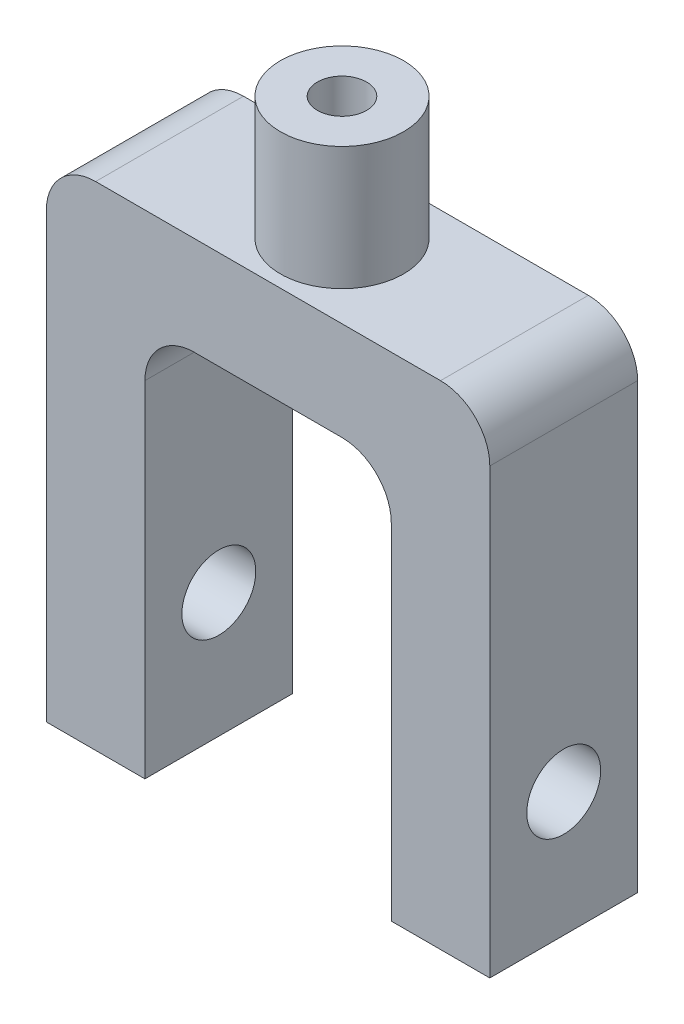
ISO-10303-21;
HEADER;
FILE_DESCRIPTION(('STEP AP214'),'2;1');
FILE_NAME('part.step','',(''),(''),'','','');
FILE_SCHEMA(('AUTOMOTIVE_DESIGN { 1 0 10303 214 1 1 1 1 }'));
ENDSEC;
DATA;
#1=APPLICATION_CONTEXT('core data for automotive mechanical design processes');
#2=APPLICATION_PROTOCOL_DEFINITION('international standard','automotive_design',2000,#1);
#3=PRODUCT_CONTEXT('',#1,'mechanical');
#4=PRODUCT('Part','Part','',(#3));
#5=PRODUCT_RELATED_PRODUCT_CATEGORY('part','',(#4));
#6=PRODUCT_DEFINITION_FORMATION('','',#4);
#7=PRODUCT_DEFINITION_CONTEXT('part definition',#1,'design');
#8=PRODUCT_DEFINITION('design','',#6,#7);
#9=PRODUCT_DEFINITION_SHAPE('','',#8);
#10=(LENGTH_UNIT() NAMED_UNIT(*) SI_UNIT(.MILLI.,.METRE.));
#11=(NAMED_UNIT(*) PLANE_ANGLE_UNIT() SI_UNIT($,.RADIAN.));
#12=(NAMED_UNIT(*) SI_UNIT($,.STERADIAN.) SOLID_ANGLE_UNIT());
#13=UNCERTAINTY_MEASURE_WITH_UNIT(LENGTH_MEASURE(1.E-05),#10,'distance_accuracy_value','');
#14=(GEOMETRIC_REPRESENTATION_CONTEXT(3) GLOBAL_UNCERTAINTY_ASSIGNED_CONTEXT((#13)) GLOBAL_UNIT_ASSIGNED_CONTEXT((#10,
#11,#12)) REPRESENTATION_CONTEXT('',''));
#15=CARTESIAN_POINT('',(0.,0.,0.));
#16=DIRECTION('',(0.,0.,1.));
#17=DIRECTION('',(1.,0.,0.));
#18=AXIS2_PLACEMENT_3D('',#15,#16,#17);
#19=CARTESIAN_POINT('',(0.,0.,30.));
#20=DIRECTION('',(0.,1.,0.));
#21=DIRECTION('',(0.,0.,1.));
#22=AXIS2_PLACEMENT_3D('',#19,#20,#21);
#23=PLANE('',#22);
#24=DIRECTION('',(1.,0.,0.));
#25=VECTOR('',#24,1.);
#26=CARTESIAN_POINT('',(0.,0.,0.));
#27=LINE('',#26,#25);
#28=CARTESIAN_POINT('',(0.,0.,0.));
#29=VERTEX_POINT('',#28);
#30=CARTESIAN_POINT('',(20.,0.,0.));
#31=VERTEX_POINT('',#30);
#32=EDGE_CURVE('E159',#29,#31,#27,.T.);
#33=ORIENTED_EDGE('',*,*,#32,.T.);
#34=DIRECTION('',(0.,0.,-1.));
#35=VECTOR('',#34,1.);
#36=CARTESIAN_POINT('',(20.,0.,30.));
#37=LINE('',#36,#35);
#38=CARTESIAN_POINT('',(20.,0.,30.));
#39=VERTEX_POINT('',#38);
#40=EDGE_CURVE('E140',#39,#31,#37,.T.);
#41=ORIENTED_EDGE('',*,*,#40,.F.);
#42=DIRECTION('',(1.,0.,0.));
#43=VECTOR('',#42,1.);
#44=CARTESIAN_POINT('',(0.,0.,30.));
#45=LINE('',#44,#43);
#46=CARTESIAN_POINT('',(0.,0.,30.));
#47=VERTEX_POINT('',#46);
#48=EDGE_CURVE('E147',#47,#39,#45,.T.);
#49=ORIENTED_EDGE('',*,*,#48,.F.);
#50=DIRECTION('',(0.,0.,-1.));
#51=VECTOR('',#50,1.);
#52=CARTESIAN_POINT('',(0.,0.,30.));
#53=LINE('',#52,#51);
#54=EDGE_CURVE('E230',#47,#29,#53,.T.);
#55=ORIENTED_EDGE('',*,*,#54,.T.);
#56=EDGE_LOOP('',(#33,#41,#49,#55));
#57=FACE_BOUND('',#56,.T.);
#58=ADVANCED_FACE('F42',(#57),#23,.F.);
#59=CARTESIAN_POINT('',(20.,0.,30.));
#60=DIRECTION('',(-1.,0.,0.));
#61=DIRECTION('',(0.,0.,1.));
#62=AXIS2_PLACEMENT_3D('',#59,#60,#61);
#63=PLANE('',#62);
#64=CARTESIAN_POINT('',(20.,25.2498921631741,15.));
#65=DIRECTION('',(-1.,0.,0.));
#66=DIRECTION('',(0.,0.,1.));
#67=AXIS2_PLACEMENT_3D('',#64,#65,#66);
#68=CIRCLE('',#67,7.5);
#69=CARTESIAN_POINT('',(20.,25.2498921631741,22.5));
#70=VERTEX_POINT('',#69);
#71=EDGE_CURVE('E218',#70,#70,#68,.T.);
#72=ORIENTED_EDGE('',*,*,#71,.T.);
#73=EDGE_LOOP('',(#72));
#74=FACE_BOUND('',#73,.T.);
#75=DIRECTION('',(0.,1.,0.));
#76=VECTOR('',#75,1.);
#77=CARTESIAN_POINT('',(20.,0.,0.));
#78=LINE('',#77,#76);
#79=CARTESIAN_POINT('',(20.,70.,0.));
#80=VERTEX_POINT('',#79);
#81=EDGE_CURVE('E213',#31,#80,#78,.T.);
#82=ORIENTED_EDGE('',*,*,#81,.T.);
#83=DIRECTION('',(0.,0.,-1.));
#84=VECTOR('',#83,1.);
#85=CARTESIAN_POINT('',(20.,70.,30.));
#86=LINE('',#85,#84);
#87=CARTESIAN_POINT('',(20.,70.,30.));
#88=VERTEX_POINT('',#87);
#89=EDGE_CURVE('E143',#80,#88,#86,.F.);
#90=ORIENTED_EDGE('',*,*,#89,.T.);
#91=DIRECTION('',(0.,1.,0.));
#92=VECTOR('',#91,1.);
#93=CARTESIAN_POINT('',(20.,0.,30.));
#94=LINE('',#93,#92);
#95=EDGE_CURVE('E135',#39,#88,#94,.T.);
#96=ORIENTED_EDGE('',*,*,#95,.F.);
#97=ORIENTED_EDGE('',*,*,#40,.T.);
#98=EDGE_LOOP('',(#82,#90,#96,#97));
#99=FACE_BOUND('',#98,.T.);
#100=ADVANCED_FACE('F138',(#74,#99),#63,.F.);
#101=CARTESIAN_POINT('',(20.,80.,30.));
#102=DIRECTION('',(0.,1.,0.));
#103=DIRECTION('',(0.,0.,1.));
#104=AXIS2_PLACEMENT_3D('',#101,#102,#103);
#105=PLANE('',#104);
#106=DIRECTION('',(1.,0.,0.));
#107=VECTOR('',#106,1.);
#108=CARTESIAN_POINT('',(20.,80.,0.));
#109=LINE('',#108,#107);
#110=CARTESIAN_POINT('',(30.,80.,0.));
#111=VERTEX_POINT('',#110);
#112=CARTESIAN_POINT('',(60.,80.,0.));
#113=VERTEX_POINT('',#112);
#114=EDGE_CURVE('E214',#111,#113,#109,.T.);
#115=ORIENTED_EDGE('',*,*,#114,.T.);
#116=DIRECTION('',(0.,0.,-1.));
#117=VECTOR('',#116,1.);
#118=CARTESIAN_POINT('',(60.,80.,30.));
#119=LINE('',#118,#117);
#120=CARTESIAN_POINT('',(60.,80.,30.));
#121=VERTEX_POINT('',#120);
#122=EDGE_CURVE('E173',#113,#121,#119,.F.);
#123=ORIENTED_EDGE('',*,*,#122,.T.);
#124=DIRECTION('',(1.,0.,0.));
#125=VECTOR('',#124,1.);
#126=CARTESIAN_POINT('',(20.,80.,30.));
#127=LINE('',#126,#125);
#128=CARTESIAN_POINT('',(30.,80.,30.));
#129=VERTEX_POINT('',#128);
#130=EDGE_CURVE('E146',#129,#121,#127,.T.);
#131=ORIENTED_EDGE('',*,*,#130,.F.);
#132=DIRECTION('',(0.,0.,-1.));
#133=VECTOR('',#132,1.);
#134=CARTESIAN_POINT('',(30.,80.,0.));
#135=LINE('',#134,#133);
#136=EDGE_CURVE('E164',#129,#111,#135,.T.);
#137=ORIENTED_EDGE('',*,*,#136,.T.);
#138=EDGE_LOOP('',(#115,#123,#131,#137));
#139=FACE_BOUND('',#138,.T.);
#140=ADVANCED_FACE('F204',(#139),#105,.F.);
#141=CARTESIAN_POINT('',(70.,80.,30.));
#142=DIRECTION('',(1.,0.,0.));
#143=DIRECTION('',(0.,1.,0.));
#144=AXIS2_PLACEMENT_3D('',#141,#142,#143);
#145=PLANE('',#144);
#146=CARTESIAN_POINT('',(70.,25.2498921631741,15.));
#147=DIRECTION('',(1.,0.,0.));
#148=DIRECTION('',(0.,1.,0.));
#149=AXIS2_PLACEMENT_3D('',#146,#147,#148);
#150=CIRCLE('',#149,7.5);
#151=CARTESIAN_POINT('',(70.,32.7498921631741,15.));
#152=VERTEX_POINT('',#151);
#153=EDGE_CURVE('E255',#152,#152,#150,.T.);
#154=ORIENTED_EDGE('',*,*,#153,.T.);
#155=EDGE_LOOP('',(#154));
#156=FACE_BOUND('',#155,.T.);
#157=DIRECTION('',(0.,-1.,0.));
#158=VECTOR('',#157,1.);
#159=CARTESIAN_POINT('',(70.,80.,30.));
#160=LINE('',#159,#158);
#161=CARTESIAN_POINT('',(70.,70.,30.));
#162=VERTEX_POINT('',#161);
#163=CARTESIAN_POINT('',(70.,0.,30.));
#164=VERTEX_POINT('',#163);
#165=EDGE_CURVE('E207',#162,#164,#160,.T.);
#166=ORIENTED_EDGE('',*,*,#165,.F.);
#167=DIRECTION('',(0.,0.,-1.));
#168=VECTOR('',#167,1.);
#169=CARTESIAN_POINT('',(70.,70.,0.));
#170=LINE('',#169,#168);
#171=CARTESIAN_POINT('',(70.,70.,0.));
#172=VERTEX_POINT('',#171);
#173=EDGE_CURVE('E160',#162,#172,#170,.T.);
#174=ORIENTED_EDGE('',*,*,#173,.T.);
#175=DIRECTION('',(0.,-1.,0.));
#176=VECTOR('',#175,1.);
#177=CARTESIAN_POINT('',(70.,80.,0.));
#178=LINE('',#177,#176);
#179=CARTESIAN_POINT('',(70.,0.,0.));
#180=VERTEX_POINT('',#179);
#181=EDGE_CURVE('E216',#172,#180,#178,.T.);
#182=ORIENTED_EDGE('',*,*,#181,.T.);
#183=DIRECTION('',(0.,0.,-1.));
#184=VECTOR('',#183,1.);
#185=CARTESIAN_POINT('',(70.,0.,30.));
#186=LINE('',#185,#184);
#187=EDGE_CURVE('E161',#164,#180,#186,.T.);
#188=ORIENTED_EDGE('',*,*,#187,.F.);
#189=EDGE_LOOP('',(#166,#174,#182,#188));
#190=FACE_BOUND('',#189,.T.);
#191=ADVANCED_FACE('F335',(#156,#190),#145,.F.);
#192=CARTESIAN_POINT('',(70.,0.,30.));
#193=DIRECTION('',(0.,1.,0.));
#194=DIRECTION('',(0.,0.,1.));
#195=AXIS2_PLACEMENT_3D('',#192,#193,#194);
#196=PLANE('',#195);
#197=DIRECTION('',(1.,0.,0.));
#198=VECTOR('',#197,1.);
#199=CARTESIAN_POINT('',(70.,0.,0.));
#200=LINE('',#199,#198);
#201=CARTESIAN_POINT('',(90.,0.,0.));
#202=VERTEX_POINT('',#201);
#203=EDGE_CURVE('E223',#180,#202,#200,.T.);
#204=ORIENTED_EDGE('',*,*,#203,.T.);
#205=DIRECTION('',(0.,0.,-1.));
#206=VECTOR('',#205,1.);
#207=CARTESIAN_POINT('',(90.,0.,30.));
#208=LINE('',#207,#206);
#209=CARTESIAN_POINT('',(90.,0.,30.));
#210=VERTEX_POINT('',#209);
#211=EDGE_CURVE('E167',#210,#202,#208,.T.);
#212=ORIENTED_EDGE('',*,*,#211,.F.);
#213=DIRECTION('',(1.,0.,0.));
#214=VECTOR('',#213,1.);
#215=CARTESIAN_POINT('',(70.,0.,30.));
#216=LINE('',#215,#214);
#217=EDGE_CURVE('E248',#164,#210,#216,.T.);
#218=ORIENTED_EDGE('',*,*,#217,.F.);
#219=ORIENTED_EDGE('',*,*,#187,.T.);
#220=EDGE_LOOP('',(#204,#212,#218,#219));
#221=FACE_BOUND('',#220,.T.);
#222=ADVANCED_FACE('F331',(#221),#196,.F.);
#223=CARTESIAN_POINT('',(90.,100.,30.));
#224=DIRECTION('',(-1.,0.,0.));
#225=DIRECTION('',(0.,-1.,0.));
#226=AXIS2_PLACEMENT_3D('',#223,#224,#225);
#227=PLANE('',#226);
#228=CARTESIAN_POINT('',(90.,25.2498921631741,15.));
#229=DIRECTION('',(1.,0.,0.));
#230=DIRECTION('',(0.,1.,0.));
#231=AXIS2_PLACEMENT_3D('',#228,#229,#230);
#232=CIRCLE('',#231,7.5);
#233=CARTESIAN_POINT('',(90.,32.7498921631741,15.));
#234=VERTEX_POINT('',#233);
#235=EDGE_CURVE('E259',#234,#234,#232,.T.);
#236=ORIENTED_EDGE('',*,*,#235,.F.);
#237=EDGE_LOOP('',(#236));
#238=FACE_BOUND('',#237,.T.);
#239=DIRECTION('',(0.,1.,0.));
#240=VECTOR('',#239,1.);
#241=CARTESIAN_POINT('',(90.,100.,0.));
#242=LINE('',#241,#240);
#243=CARTESIAN_POINT('',(90.,90.,0.));
#244=VERTEX_POINT('',#243);
#245=EDGE_CURVE('E225',#202,#244,#242,.T.);
#246=ORIENTED_EDGE('',*,*,#245,.T.);
#247=DIRECTION('',(0.,0.,-1.));
#248=VECTOR('',#247,1.);
#249=CARTESIAN_POINT('',(90.,90.,30.));
#250=LINE('',#249,#248);
#251=CARTESIAN_POINT('',(90.,90.,30.));
#252=VERTEX_POINT('',#251);
#253=EDGE_CURVE('E57',#244,#252,#250,.F.);
#254=ORIENTED_EDGE('',*,*,#253,.T.);
#255=DIRECTION('',(0.,1.,0.));
#256=VECTOR('',#255,1.);
#257=CARTESIAN_POINT('',(90.,100.,30.));
#258=LINE('',#257,#256);
#259=EDGE_CURVE('E235',#210,#252,#258,.T.);
#260=ORIENTED_EDGE('',*,*,#259,.F.);
#261=ORIENTED_EDGE('',*,*,#211,.T.);
#262=EDGE_LOOP('',(#246,#254,#260,#261));
#263=FACE_BOUND('',#262,.T.);
#264=ADVANCED_FACE('F234',(#238,#263),#227,.F.);
#265=CARTESIAN_POINT('',(0.,100.,30.));
#266=DIRECTION('',(0.,-1.,0.));
#267=DIRECTION('',(0.,0.,-1.));
#268=AXIS2_PLACEMENT_3D('',#265,#266,#267);
#269=PLANE('',#268);
#270=CARTESIAN_POINT('',(45.,100.,15.));
#271=DIRECTION('',(0.,-1.,0.));
#272=DIRECTION('',(0.,0.,-1.));
#273=AXIS2_PLACEMENT_3D('',#270,#271,#272);
#274=CIRCLE('',#273,12.5);
#275=CARTESIAN_POINT('',(45.,100.,2.5));
#276=VERTEX_POINT('',#275);
#277=EDGE_CURVE('E11',#276,#276,#274,.F.);
#278=ORIENTED_EDGE('',*,*,#277,.F.);
#279=EDGE_LOOP('',(#278));
#280=FACE_BOUND('',#279,.T.);
#281=DIRECTION('',(-1.,0.,0.));
#282=VECTOR('',#281,1.);
#283=CARTESIAN_POINT('',(0.,100.,0.));
#284=LINE('',#283,#282);
#285=CARTESIAN_POINT('',(80.,100.,0.));
#286=VERTEX_POINT('',#285);
#287=CARTESIAN_POINT('',(10.,100.,0.));
#288=VERTEX_POINT('',#287);
#289=EDGE_CURVE('E227',#286,#288,#284,.T.);
#290=ORIENTED_EDGE('',*,*,#289,.T.);
#291=DIRECTION('',(0.,0.,-1.));
#292=VECTOR('',#291,1.);
#293=CARTESIAN_POINT('',(10.,100.,30.));
#294=LINE('',#293,#292);
#295=CARTESIAN_POINT('',(10.,100.,30.));
#296=VERTEX_POINT('',#295);
#297=EDGE_CURVE('E65',#288,#296,#294,.F.);
#298=ORIENTED_EDGE('',*,*,#297,.T.);
#299=DIRECTION('',(-1.,0.,0.));
#300=VECTOR('',#299,1.);
#301=CARTESIAN_POINT('',(0.,100.,30.));
#302=LINE('',#301,#300);
#303=CARTESIAN_POINT('',(80.,100.,30.));
#304=VERTEX_POINT('',#303);
#305=EDGE_CURVE('E245',#304,#296,#302,.T.);
#306=ORIENTED_EDGE('',*,*,#305,.F.);
#307=DIRECTION('',(0.,0.,-1.));
#308=VECTOR('',#307,1.);
#309=CARTESIAN_POINT('',(80.,100.,30.));
#310=LINE('',#309,#308);
#311=EDGE_CURVE('E183',#304,#286,#310,.T.);
#312=ORIENTED_EDGE('',*,*,#311,.T.);
#313=EDGE_LOOP('',(#290,#298,#306,#312));
#314=FACE_BOUND('',#313,.T.);
#315=ADVANCED_FACE('F244',(#280,#314),#269,.F.);
#316=CARTESIAN_POINT('',(0.,0.,30.));
#317=DIRECTION('',(1.,0.,0.));
#318=DIRECTION('',(0.,0.,-1.));
#319=AXIS2_PLACEMENT_3D('',#316,#317,#318);
#320=PLANE('',#319);
#321=CARTESIAN_POINT('',(0.,25.2498921631741,15.));
#322=DIRECTION('',(1.,0.,0.));
#323=DIRECTION('',(0.,1.,0.));
#324=AXIS2_PLACEMENT_3D('',#321,#322,#323);
#325=CIRCLE('',#324,7.5);
#326=CARTESIAN_POINT('',(0.,32.7498921631741,15.));
#327=VERTEX_POINT('',#326);
#328=EDGE_CURVE('E258',#327,#327,#325,.T.);
#329=ORIENTED_EDGE('',*,*,#328,.T.);
#330=EDGE_LOOP('',(#329));
#331=FACE_BOUND('',#330,.T.);
#332=DIRECTION('',(0.,-1.,0.));
#333=VECTOR('',#332,1.);
#334=CARTESIAN_POINT('',(0.,0.,30.));
#335=LINE('',#334,#333);
#336=CARTESIAN_POINT('',(0.,90.,30.));
#337=VERTEX_POINT('',#336);
#338=EDGE_CURVE('E152',#337,#47,#335,.T.);
#339=ORIENTED_EDGE('',*,*,#338,.F.);
#340=DIRECTION('',(0.,0.,-1.));
#341=VECTOR('',#340,1.);
#342=CARTESIAN_POINT('',(0.,90.,30.));
#343=LINE('',#342,#341);
#344=CARTESIAN_POINT('',(0.,90.,0.));
#345=VERTEX_POINT('',#344);
#346=EDGE_CURVE('E176',#337,#345,#343,.T.);
#347=ORIENTED_EDGE('',*,*,#346,.T.);
#348=DIRECTION('',(0.,-1.,0.));
#349=VECTOR('',#348,1.);
#350=CARTESIAN_POINT('',(0.,0.,0.));
#351=LINE('',#350,#349);
#352=EDGE_CURVE('E156',#345,#29,#351,.T.);
#353=ORIENTED_EDGE('',*,*,#352,.T.);
#354=ORIENTED_EDGE('',*,*,#54,.F.);
#355=EDGE_LOOP('',(#339,#347,#353,#354));
#356=FACE_BOUND('',#355,.T.);
#357=ADVANCED_FACE('F315',(#331,#356),#320,.F.);
#358=CARTESIAN_POINT('',(0.,0.,30.));
#359=DIRECTION('',(0.,0.,1.));
#360=DIRECTION('',(1.,0.,0.));
#361=AXIS2_PLACEMENT_3D('',#358,#359,#360);
#362=PLANE('',#361);
#363=ORIENTED_EDGE('',*,*,#305,.T.);
#364=CARTESIAN_POINT('',(10.,90.,30.));
#365=DIRECTION('',(0.,0.,1.));
#366=DIRECTION('',(1.,0.,0.));
#367=AXIS2_PLACEMENT_3D('',#364,#365,#366);
#368=CIRCLE('',#367,10.);
#369=EDGE_CURVE('E189',#296,#337,#368,.T.);
#370=ORIENTED_EDGE('',*,*,#369,.T.);
#371=ORIENTED_EDGE('',*,*,#338,.T.);
#372=ORIENTED_EDGE('',*,*,#48,.T.);
#373=ORIENTED_EDGE('',*,*,#95,.T.);
#374=CARTESIAN_POINT('',(30.,70.,30.));
#375=DIRECTION('',(0.,0.,1.));
#376=DIRECTION('',(1.,0.,0.));
#377=AXIS2_PLACEMENT_3D('',#374,#375,#376);
#378=CIRCLE('',#377,10.);
#379=EDGE_CURVE('E50',#88,#129,#378,.F.);
#380=ORIENTED_EDGE('',*,*,#379,.T.);
#381=ORIENTED_EDGE('',*,*,#130,.T.);
#382=CARTESIAN_POINT('',(60.,70.,30.));
#383=DIRECTION('',(0.,0.,1.));
#384=DIRECTION('',(1.,0.,0.));
#385=AXIS2_PLACEMENT_3D('',#382,#383,#384);
#386=CIRCLE('',#385,10.);
#387=EDGE_CURVE('E194',#121,#162,#386,.F.);
#388=ORIENTED_EDGE('',*,*,#387,.T.);
#389=ORIENTED_EDGE('',*,*,#165,.T.);
#390=ORIENTED_EDGE('',*,*,#217,.T.);
#391=ORIENTED_EDGE('',*,*,#259,.T.);
#392=CARTESIAN_POINT('',(80.,90.,30.));
#393=DIRECTION('',(0.,0.,1.));
#394=DIRECTION('',(1.,0.,0.));
#395=AXIS2_PLACEMENT_3D('',#392,#393,#394);
#396=CIRCLE('',#395,10.);
#397=EDGE_CURVE('E187',#252,#304,#396,.T.);
#398=ORIENTED_EDGE('',*,*,#397,.T.);
#399=EDGE_LOOP('',(#363,#370,#371,#372,#373,#380,#381,#388,#389,#390,#391,#398));
#400=FACE_BOUND('',#399,.T.);
#401=ADVANCED_FACE('F150',(#400),#362,.T.);
#402=CARTESIAN_POINT('',(0.,0.,0.));
#403=DIRECTION('',(0.,0.,1.));
#404=DIRECTION('',(1.,0.,0.));
#405=AXIS2_PLACEMENT_3D('',#402,#403,#404);
#406=PLANE('',#405);
#407=ORIENTED_EDGE('',*,*,#352,.F.);
#408=CARTESIAN_POINT('',(10.,90.,0.));
#409=DIRECTION('',(0.,0.,1.));
#410=DIRECTION('',(1.,0.,0.));
#411=AXIS2_PLACEMENT_3D('',#408,#409,#410);
#412=CIRCLE('',#411,10.);
#413=EDGE_CURVE('E181',#345,#288,#412,.F.);
#414=ORIENTED_EDGE('',*,*,#413,.T.);
#415=ORIENTED_EDGE('',*,*,#289,.F.);
#416=CARTESIAN_POINT('',(80.,90.,0.));
#417=DIRECTION('',(0.,0.,1.));
#418=DIRECTION('',(1.,0.,0.));
#419=AXIS2_PLACEMENT_3D('',#416,#417,#418);
#420=CIRCLE('',#419,10.);
#421=EDGE_CURVE('E179',#286,#244,#420,.F.);
#422=ORIENTED_EDGE('',*,*,#421,.T.);
#423=ORIENTED_EDGE('',*,*,#245,.F.);
#424=ORIENTED_EDGE('',*,*,#203,.F.);
#425=ORIENTED_EDGE('',*,*,#181,.F.);
#426=CARTESIAN_POINT('',(60.,70.,0.));
#427=DIRECTION('',(0.,0.,1.));
#428=DIRECTION('',(1.,0.,0.));
#429=AXIS2_PLACEMENT_3D('',#426,#427,#428);
#430=CIRCLE('',#429,10.);
#431=EDGE_CURVE('E192',#172,#113,#430,.T.);
#432=ORIENTED_EDGE('',*,*,#431,.T.);
#433=ORIENTED_EDGE('',*,*,#114,.F.);
#434=CARTESIAN_POINT('',(30.,70.,0.));
#435=DIRECTION('',(0.,0.,1.));
#436=DIRECTION('',(1.,0.,0.));
#437=AXIS2_PLACEMENT_3D('',#434,#435,#436);
#438=CIRCLE('',#437,10.);
#439=EDGE_CURVE('E196',#111,#80,#438,.T.);
#440=ORIENTED_EDGE('',*,*,#439,.T.);
#441=ORIENTED_EDGE('',*,*,#81,.F.);
#442=ORIENTED_EDGE('',*,*,#32,.F.);
#443=EDGE_LOOP('',(#407,#414,#415,#422,#423,#424,#425,#432,#433,#440,#441,#442));
#444=FACE_BOUND('',#443,.T.);
#445=ADVANCED_FACE('F212',(#444),#406,.F.);
#446=CARTESIAN_POINT('',(60.,70.,30.));
#447=DIRECTION('',(0.,0.,1.));
#448=DIRECTION('',(1.,0.,0.));
#449=AXIS2_PLACEMENT_3D('',#446,#447,#448);
#450=CYLINDRICAL_SURFACE('',#449,10.);
#451=ORIENTED_EDGE('',*,*,#387,.F.);
#452=ORIENTED_EDGE('',*,*,#122,.F.);
#453=ORIENTED_EDGE('',*,*,#431,.F.);
#454=ORIENTED_EDGE('',*,*,#173,.F.);
#455=EDGE_LOOP('',(#451,#452,#453,#454));
#456=FACE_BOUND('',#455,.T.);
#457=ADVANCED_FACE('F302',(#456),#450,.F.);
#458=CARTESIAN_POINT('',(30.,70.,30.));
#459=DIRECTION('',(0.,0.,1.));
#460=DIRECTION('',(1.,0.,0.));
#461=AXIS2_PLACEMENT_3D('',#458,#459,#460);
#462=CYLINDRICAL_SURFACE('',#461,10.);
#463=ORIENTED_EDGE('',*,*,#379,.F.);
#464=ORIENTED_EDGE('',*,*,#89,.F.);
#465=ORIENTED_EDGE('',*,*,#439,.F.);
#466=ORIENTED_EDGE('',*,*,#136,.F.);
#467=EDGE_LOOP('',(#463,#464,#465,#466));
#468=FACE_BOUND('',#467,.T.);
#469=ADVANCED_FACE('F209',(#468),#462,.F.);
#470=CARTESIAN_POINT('',(10.,90.,30.));
#471=DIRECTION('',(0.,0.,-1.));
#472=DIRECTION('',(-1.,0.,0.));
#473=AXIS2_PLACEMENT_3D('',#470,#471,#472);
#474=CYLINDRICAL_SURFACE('',#473,10.);
#475=ORIENTED_EDGE('',*,*,#369,.F.);
#476=ORIENTED_EDGE('',*,*,#297,.F.);
#477=ORIENTED_EDGE('',*,*,#413,.F.);
#478=ORIENTED_EDGE('',*,*,#346,.F.);
#479=EDGE_LOOP('',(#475,#476,#477,#478));
#480=FACE_BOUND('',#479,.T.);
#481=ADVANCED_FACE('F307',(#480),#474,.T.);
#482=CARTESIAN_POINT('',(80.,90.,30.));
#483=DIRECTION('',(0.,0.,-1.));
#484=DIRECTION('',(-1.,0.,0.));
#485=AXIS2_PLACEMENT_3D('',#482,#483,#484);
#486=CYLINDRICAL_SURFACE('',#485,10.);
#487=ORIENTED_EDGE('',*,*,#397,.F.);
#488=ORIENTED_EDGE('',*,*,#253,.F.);
#489=ORIENTED_EDGE('',*,*,#421,.F.);
#490=ORIENTED_EDGE('',*,*,#311,.F.);
#491=EDGE_LOOP('',(#487,#488,#489,#490));
#492=FACE_BOUND('',#491,.T.);
#493=ADVANCED_FACE('F44',(#492),#486,.T.);
#494=CARTESIAN_POINT('',(0.,25.2498921631741,15.));
#495=DIRECTION('',(1.,0.,0.));
#496=DIRECTION('',(0.,1.,0.));
#497=AXIS2_PLACEMENT_3D('',#494,#495,#496);
#498=CYLINDRICAL_SURFACE('',#497,7.5);
#499=ORIENTED_EDGE('',*,*,#328,.F.);
#500=EDGE_LOOP('',(#499));
#501=FACE_BOUND('',#500,.T.);
#502=ORIENTED_EDGE('',*,*,#71,.F.);
#503=EDGE_LOOP('',(#502));
#504=FACE_BOUND('',#503,.T.);
#505=ADVANCED_FACE('F289',(#501,#504),#498,.F.);
#506=ORIENTED_EDGE('',*,*,#235,.T.);
#507=EDGE_LOOP('',(#506));
#508=FACE_BOUND('',#507,.T.);
#509=ORIENTED_EDGE('',*,*,#153,.F.);
#510=EDGE_LOOP('',(#509));
#511=FACE_BOUND('',#510,.T.);
#512=ADVANCED_FACE('F280',(#508,#511),#498,.F.);
#513=CARTESIAN_POINT('',(45.,125.,15.));
#514=DIRECTION('',(0.,1.,0.));
#515=DIRECTION('',(0.,0.,1.));
#516=AXIS2_PLACEMENT_3D('',#513,#514,#515);
#517=PLANE('',#516);
#518=CARTESIAN_POINT('',(45.,125.,15.));
#519=DIRECTION('',(0.,1.,0.));
#520=DIRECTION('',(0.,0.,1.));
#521=AXIS2_PLACEMENT_3D('',#518,#519,#520);
#522=CIRCLE('',#521,12.5);
#523=CARTESIAN_POINT('',(45.,125.,27.5));
#524=VERTEX_POINT('',#523);
#525=EDGE_CURVE('E262',#524,#524,#522,.T.);
#526=ORIENTED_EDGE('',*,*,#525,.T.);
#527=EDGE_LOOP('',(#526));
#528=FACE_BOUND('',#527,.T.);
#529=CARTESIAN_POINT('',(45.,125.,15.));
#530=DIRECTION('',(0.,1.,0.));
#531=DIRECTION('',(0.,0.,1.));
#532=AXIS2_PLACEMENT_3D('',#529,#530,#531);
#533=CIRCLE('',#532,5.);
#534=CARTESIAN_POINT('',(45.,125.,20.));
#535=VERTEX_POINT('',#534);
#536=EDGE_CURVE('E267',#535,#535,#533,.T.);
#537=ORIENTED_EDGE('',*,*,#536,.F.);
#538=EDGE_LOOP('',(#537));
#539=FACE_BOUND('',#538,.T.);
#540=ADVANCED_FACE('F277',(#528,#539),#517,.T.);
#541=CARTESIAN_POINT('',(45.,125.,15.));
#542=DIRECTION('',(0.,-1.,0.));
#543=DIRECTION('',(0.,0.,-1.));
#544=AXIS2_PLACEMENT_3D('',#541,#542,#543);
#545=CYLINDRICAL_SURFACE('',#544,12.5);
#546=ORIENTED_EDGE('',*,*,#525,.F.);
#547=EDGE_LOOP('',(#546));
#548=FACE_BOUND('',#547,.T.);
#549=ORIENTED_EDGE('',*,*,#277,.T.);
#550=EDGE_LOOP('',(#549));
#551=FACE_BOUND('',#550,.T.);
#552=ADVANCED_FACE('F279',(#548,#551),#545,.T.);
#553=CARTESIAN_POINT('',(45.,125.,15.));
#554=DIRECTION('',(0.,-1.,0.));
#555=DIRECTION('',(0.,0.,-1.));
#556=AXIS2_PLACEMENT_3D('',#553,#554,#555);
#557=CYLINDRICAL_SURFACE('',#556,5.);
#558=ORIENTED_EDGE('',*,*,#536,.T.);
#559=EDGE_LOOP('',(#558));
#560=FACE_BOUND('',#559,.T.);
#561=CARTESIAN_POINT('',(45.,100.,15.));
#562=DIRECTION('',(0.,1.,0.));
#563=DIRECTION('',(0.,0.,1.));
#564=AXIS2_PLACEMENT_3D('',#561,#562,#563);
#565=CIRCLE('',#564,5.);
#566=CARTESIAN_POINT('',(45.,100.,20.));
#567=VERTEX_POINT('',#566);
#568=EDGE_CURVE('E268',#567,#567,#565,.T.);
#569=ORIENTED_EDGE('',*,*,#568,.F.);
#570=EDGE_LOOP('',(#569));
#571=FACE_BOUND('',#570,.T.);
#572=ADVANCED_FACE('F274',(#560,#571),#557,.F.);
#573=ORIENTED_EDGE('',*,*,#568,.T.);
#574=EDGE_LOOP('',(#573));
#575=FACE_BOUND('',#574,.T.);
#576=ADVANCED_FACE('F326',(#575),#269,.F.);
#577=CLOSED_SHELL('',(#58,#100,#140,#191,#222,#264,#315,#357,#401,#445,#457,#469,#481,#493,#505,
#512,#540,#552,#572,#576));
#578=MANIFOLD_SOLID_BREP('B2',#577);
#579=ADVANCED_BREP_SHAPE_REPRESENTATION('',(#18,#578),#14);
#580=SHAPE_DEFINITION_REPRESENTATION(#9,#579);
ENDSEC;
END-ISO-10303-21;
